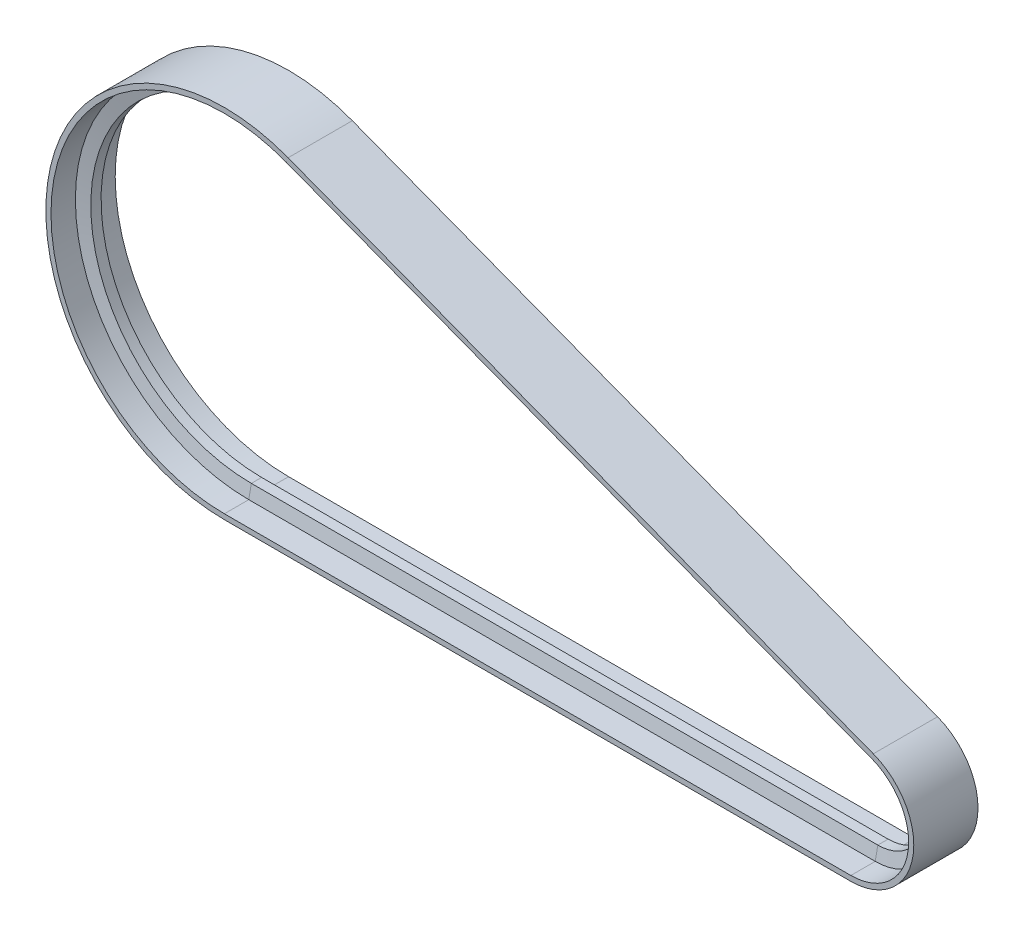
ISO-10303-21;
HEADER;
FILE_DESCRIPTION(('STEP AP214'),'2;1');
FILE_NAME('part.step','',(''),(''),'','','');
FILE_SCHEMA(('AUTOMOTIVE_DESIGN { 1 0 10303 214 1 1 1 1 }'));
ENDSEC;
DATA;
#1=APPLICATION_CONTEXT('core data for automotive mechanical design processes');
#2=APPLICATION_PROTOCOL_DEFINITION('international standard','automotive_design',2000,#1);
#3=PRODUCT_CONTEXT('',#1,'mechanical');
#4=PRODUCT('Part','Part','',(#3));
#5=PRODUCT_RELATED_PRODUCT_CATEGORY('part','',(#4));
#6=PRODUCT_DEFINITION_FORMATION('','',#4);
#7=PRODUCT_DEFINITION_CONTEXT('part definition',#1,'design');
#8=PRODUCT_DEFINITION('design','',#6,#7);
#9=PRODUCT_DEFINITION_SHAPE('','',#8);
#10=(LENGTH_UNIT() NAMED_UNIT(*) SI_UNIT(.MILLI.,.METRE.));
#11=(NAMED_UNIT(*) PLANE_ANGLE_UNIT() SI_UNIT($,.RADIAN.));
#12=(NAMED_UNIT(*) SI_UNIT($,.STERADIAN.) SOLID_ANGLE_UNIT());
#13=UNCERTAINTY_MEASURE_WITH_UNIT(LENGTH_MEASURE(1.E-05),#10,'distance_accuracy_value','');
#14=(GEOMETRIC_REPRESENTATION_CONTEXT(3) GLOBAL_UNCERTAINTY_ASSIGNED_CONTEXT((#13)) GLOBAL_UNIT_ASSIGNED_CONTEXT((#10,
#11,#12)) REPRESENTATION_CONTEXT('',''));
#15=CARTESIAN_POINT('',(0.,0.,0.));
#16=DIRECTION('',(0.,0.,1.));
#17=DIRECTION('',(1.,0.,0.));
#18=AXIS2_PLACEMENT_3D('',#15,#16,#17);
#19=CARTESIAN_POINT('',(24.0893315908228,63.0551671436004,12.5));
#20=DIRECTION('',(0.356878986530708,0.934150624349636,0.));
#21=DIRECTION('',(-0.934150624349636,0.356878986530709,0.));
#22=AXIS2_PLACEMENT_3D('',#19,#20,#21);
#23=PLANE('',#22);
#24=DIRECTION('',(0.934150624349636,-0.356878986530709,0.));
#25=VECTOR('',#24,1.);
#26=CARTESIAN_POINT('',(24.0893315908228,63.0551671436004,3.));
#27=LINE('',#26,#25);
#28=CARTESIAN_POINT('',(24.0893315908228,63.0551671436004,3.));
#29=VERTEX_POINT('',#28);
#30=CARTESIAN_POINT('',(251.912945947882,-23.9816109521333,3.));
#31=VERTEX_POINT('',#30);
#32=EDGE_CURVE('E558',#29,#31,#27,.T.);
#33=ORIENTED_EDGE('',*,*,#32,.T.);
#34=DIRECTION('',(0.,0.,-1.));
#35=VECTOR('',#34,1.);
#36=CARTESIAN_POINT('',(251.912945947882,-23.9816109521332,12.5));
#37=LINE('',#36,#35);
#38=CARTESIAN_POINT('',(251.912945947882,-23.9816109521332,12.5));
#39=VERTEX_POINT('',#38);
#40=EDGE_CURVE('E260',#39,#31,#37,.T.);
#41=ORIENTED_EDGE('',*,*,#40,.F.);
#42=DIRECTION('',(0.934150624349636,-0.356878986530709,0.));
#43=VECTOR('',#42,1.);
#44=CARTESIAN_POINT('',(24.0893315908228,63.0551671436004,12.5));
#45=LINE('',#44,#43);
#46=CARTESIAN_POINT('',(24.0893315908228,63.0551671436004,12.5));
#47=VERTEX_POINT('',#46);
#48=EDGE_CURVE('E224',#47,#39,#45,.T.);
#49=ORIENTED_EDGE('',*,*,#48,.F.);
#50=DIRECTION('',(0.,0.,-1.));
#51=VECTOR('',#50,1.);
#52=CARTESIAN_POINT('',(24.0893315908228,63.0551671436004,12.5));
#53=LINE('',#52,#51);
#54=EDGE_CURVE('E247',#47,#29,#53,.T.);
#55=ORIENTED_EDGE('',*,*,#54,.T.);
#56=EDGE_LOOP('',(#33,#41,#49,#55));
#57=FACE_BOUND('',#56,.T.);
#58=ADVANCED_FACE('F56',(#57),#23,.F.);
#59=DIRECTION('',(0.934150624349636,-0.356878986530709,0.));
#60=VECTOR('',#59,1.);
#61=CARTESIAN_POINT('',(24.0893315908228,63.0551671436004,-3.));
#62=LINE('',#61,#60);
#63=CARTESIAN_POINT('',(24.0893315908228,63.0551671436004,-3.));
#64=VERTEX_POINT('',#63);
#65=CARTESIAN_POINT('',(251.912945947882,-23.9816109521332,-3.));
#66=VERTEX_POINT('',#65);
#67=EDGE_CURVE('E556',#64,#66,#62,.T.);
#68=ORIENTED_EDGE('',*,*,#67,.F.);
#69=CARTESIAN_POINT('',(24.0893315908228,63.0551671436004,-12.5));
#70=VERTEX_POINT('',#69);
#71=EDGE_CURVE('E251',#64,#70,#53,.T.);
#72=ORIENTED_EDGE('',*,*,#71,.T.);
#73=DIRECTION('',(0.934150624349636,-0.356878986530709,0.));
#74=VECTOR('',#73,1.);
#75=CARTESIAN_POINT('',(24.0893315908228,63.0551671436004,-12.5));
#76=LINE('',#75,#74);
#77=CARTESIAN_POINT('',(251.912945947882,-23.9816109521332,-12.5));
#78=VERTEX_POINT('',#77);
#79=EDGE_CURVE('E236',#70,#78,#76,.T.);
#80=ORIENTED_EDGE('',*,*,#79,.T.);
#81=EDGE_CURVE('E235',#66,#78,#37,.T.);
#82=ORIENTED_EDGE('',*,*,#81,.F.);
#83=EDGE_LOOP('',(#68,#72,#80,#82));
#84=FACE_BOUND('',#83,.T.);
#85=ADVANCED_FACE('F317',(#84),#23,.F.);
#86=CARTESIAN_POINT('',(0.,0.,12.5));
#87=DIRECTION('',(0.,0.,-1.));
#88=DIRECTION('',(-1.,0.,0.));
#89=AXIS2_PLACEMENT_3D('',#86,#87,#88);
#90=CYLINDRICAL_SURFACE('',#89,67.5);
#91=DIRECTION('',(0.,0.,-1.));
#92=VECTOR('',#91,1.);
#93=CARTESIAN_POINT('',(0.,-67.5,12.5));
#94=LINE('',#93,#92);
#95=CARTESIAN_POINT('',(0.,-67.5,12.5));
#96=VERTEX_POINT('',#95);
#97=CARTESIAN_POINT('',(0.,-67.5,3.));
#98=VERTEX_POINT('',#97);
#99=EDGE_CURVE('E252',#96,#98,#94,.T.);
#100=ORIENTED_EDGE('',*,*,#99,.T.);
#101=CARTESIAN_POINT('',(0.,0.,3.));
#102=DIRECTION('',(0.,0.,-1.));
#103=DIRECTION('',(0.,-1.,0.));
#104=AXIS2_PLACEMENT_3D('',#101,#102,#103);
#105=CIRCLE('',#104,67.5);
#106=EDGE_CURVE('E555',#98,#29,#105,.T.);
#107=ORIENTED_EDGE('',*,*,#106,.T.);
#108=ORIENTED_EDGE('',*,*,#54,.F.);
#109=CARTESIAN_POINT('',(0.,0.,12.5));
#110=DIRECTION('',(0.,0.,1.));
#111=DIRECTION('',(1.,0.,0.));
#112=AXIS2_PLACEMENT_3D('',#109,#110,#111);
#113=CIRCLE('',#112,67.5);
#114=EDGE_CURVE('E233',#47,#96,#113,.T.);
#115=ORIENTED_EDGE('',*,*,#114,.T.);
#116=EDGE_LOOP('',(#100,#107,#108,#115));
#117=FACE_BOUND('',#116,.T.);
#118=ADVANCED_FACE('F322',(#117),#90,.F.);
#119=ORIENTED_EDGE('',*,*,#71,.F.);
#120=CARTESIAN_POINT('',(0.,0.,-3.));
#121=DIRECTION('',(0.,0.,-1.));
#122=DIRECTION('',(0.,-1.,0.));
#123=AXIS2_PLACEMENT_3D('',#120,#121,#122);
#124=CIRCLE('',#123,67.5);
#125=CARTESIAN_POINT('',(0.,-67.5,-3.));
#126=VERTEX_POINT('',#125);
#127=EDGE_CURVE('E217',#126,#64,#124,.T.);
#128=ORIENTED_EDGE('',*,*,#127,.F.);
#129=CARTESIAN_POINT('',(0.,-67.5,-12.5));
#130=VERTEX_POINT('',#129);
#131=EDGE_CURVE('E255',#126,#130,#94,.T.);
#132=ORIENTED_EDGE('',*,*,#131,.T.);
#133=CARTESIAN_POINT('',(0.,0.,-12.5));
#134=DIRECTION('',(0.,0.,1.));
#135=DIRECTION('',(1.,0.,0.));
#136=AXIS2_PLACEMENT_3D('',#133,#134,#135);
#137=CIRCLE('',#136,67.5);
#138=EDGE_CURVE('E228',#70,#130,#137,.T.);
#139=ORIENTED_EDGE('',*,*,#138,.F.);
#140=EDGE_LOOP('',(#119,#128,#132,#139));
#141=FACE_BOUND('',#140,.T.);
#142=ADVANCED_FACE('F335',(#141),#90,.F.);
#143=CARTESIAN_POINT('',(0.,-67.5,12.5));
#144=DIRECTION('',(0.,1.,0.));
#145=DIRECTION('',(0.,0.,1.));
#146=AXIS2_PLACEMENT_3D('',#143,#144,#145);
#147=PLANE('',#146);
#148=DIRECTION('',(0.,0.,-1.));
#149=VECTOR('',#148,1.);
#150=CARTESIAN_POINT('',(243.883168750941,-67.5,12.5));
#151=LINE('',#150,#149);
#152=CARTESIAN_POINT('',(243.883168750941,-67.5,12.5));
#153=VERTEX_POINT('',#152);
#154=CARTESIAN_POINT('',(243.883168750941,-67.5,3.));
#155=VERTEX_POINT('',#154);
#156=EDGE_CURVE('E256',#153,#155,#151,.T.);
#157=ORIENTED_EDGE('',*,*,#156,.T.);
#158=DIRECTION('',(-1.,0.,0.));
#159=VECTOR('',#158,1.);
#160=CARTESIAN_POINT('',(243.883168750941,-67.5,3.));
#161=LINE('',#160,#159);
#162=EDGE_CURVE('E81',#155,#98,#161,.T.);
#163=ORIENTED_EDGE('',*,*,#162,.T.);
#164=ORIENTED_EDGE('',*,*,#99,.F.);
#165=DIRECTION('',(1.,0.,0.));
#166=VECTOR('',#165,1.);
#167=CARTESIAN_POINT('',(0.,-67.5,12.5));
#168=LINE('',#167,#166);
#169=EDGE_CURVE('E230',#96,#153,#168,.T.);
#170=ORIENTED_EDGE('',*,*,#169,.T.);
#171=EDGE_LOOP('',(#157,#163,#164,#170));
#172=FACE_BOUND('',#171,.T.);
#173=ADVANCED_FACE('F332',(#172),#147,.T.);
#174=ORIENTED_EDGE('',*,*,#131,.F.);
#175=DIRECTION('',(-1.,0.,0.));
#176=VECTOR('',#175,1.);
#177=CARTESIAN_POINT('',(243.883168750941,-67.5,-3.));
#178=LINE('',#177,#176);
#179=CARTESIAN_POINT('',(243.883168750941,-67.5,-3.));
#180=VERTEX_POINT('',#179);
#181=EDGE_CURVE('E208',#180,#126,#178,.T.);
#182=ORIENTED_EDGE('',*,*,#181,.F.);
#183=CARTESIAN_POINT('',(243.883168750941,-67.5,-12.5));
#184=VERTEX_POINT('',#183);
#185=EDGE_CURVE('E259',#180,#184,#151,.T.);
#186=ORIENTED_EDGE('',*,*,#185,.T.);
#187=DIRECTION('',(1.,0.,0.));
#188=VECTOR('',#187,1.);
#189=CARTESIAN_POINT('',(0.,-67.5,-12.5));
#190=LINE('',#189,#188);
#191=EDGE_CURVE('E242',#130,#184,#190,.T.);
#192=ORIENTED_EDGE('',*,*,#191,.F.);
#193=EDGE_LOOP('',(#174,#182,#186,#192));
#194=FACE_BOUND('',#193,.T.);
#195=ADVANCED_FACE('F330',(#194),#147,.T.);
#196=CARTESIAN_POINT('',(243.883168750941,-45.,12.5));
#197=DIRECTION('',(0.,0.,-1.));
#198=DIRECTION('',(-1.,0.,0.));
#199=AXIS2_PLACEMENT_3D('',#196,#197,#198);
#200=CYLINDRICAL_SURFACE('',#199,22.5);
#201=ORIENTED_EDGE('',*,*,#40,.T.);
#202=CARTESIAN_POINT('',(243.883168750941,-45.,3.));
#203=DIRECTION('',(0.,0.,-1.));
#204=DIRECTION('',(0.356878986530709,0.934150624349636,0.));
#205=AXIS2_PLACEMENT_3D('',#202,#203,#204);
#206=CIRCLE('',#205,22.5);
#207=EDGE_CURVE('E552',#31,#155,#206,.T.);
#208=ORIENTED_EDGE('',*,*,#207,.T.);
#209=ORIENTED_EDGE('',*,*,#156,.F.);
#210=CARTESIAN_POINT('',(243.883168750941,-45.,12.5));
#211=DIRECTION('',(0.,0.,1.));
#212=DIRECTION('',(1.,0.,0.));
#213=AXIS2_PLACEMENT_3D('',#210,#211,#212);
#214=CIRCLE('',#213,22.5);
#215=EDGE_CURVE('E227',#153,#39,#214,.T.);
#216=ORIENTED_EDGE('',*,*,#215,.T.);
#217=EDGE_LOOP('',(#201,#208,#209,#216));
#218=FACE_BOUND('',#217,.T.);
#219=ADVANCED_FACE('F326',(#218),#200,.F.);
#220=ORIENTED_EDGE('',*,*,#185,.F.);
#221=CARTESIAN_POINT('',(243.883168750941,-45.,-3.));
#222=DIRECTION('',(0.,0.,-1.));
#223=DIRECTION('',(0.356878986530709,0.934150624349636,0.));
#224=AXIS2_PLACEMENT_3D('',#221,#222,#223);
#225=CIRCLE('',#224,22.5);
#226=EDGE_CURVE('E223',#66,#180,#225,.T.);
#227=ORIENTED_EDGE('',*,*,#226,.F.);
#228=ORIENTED_EDGE('',*,*,#81,.T.);
#229=CARTESIAN_POINT('',(243.883168750941,-45.,-12.5));
#230=DIRECTION('',(0.,0.,1.));
#231=DIRECTION('',(1.,0.,0.));
#232=AXIS2_PLACEMENT_3D('',#229,#230,#231);
#233=CIRCLE('',#232,22.5);
#234=EDGE_CURVE('E239',#184,#78,#233,.T.);
#235=ORIENTED_EDGE('',*,*,#234,.F.);
#236=EDGE_LOOP('',(#220,#227,#228,#235));
#237=FACE_BOUND('',#236,.T.);
#238=ADVANCED_FACE('F329',(#237),#200,.F.);
#239=CARTESIAN_POINT('',(24.8030895638842,64.9234683922997,12.5));
#240=DIRECTION('',(0.356878986530708,0.934150624349636,0.));
#241=DIRECTION('',(-0.934150624349636,0.356878986530709,0.));
#242=AXIS2_PLACEMENT_3D('',#239,#240,#241);
#243=PLANE('',#242);
#244=DIRECTION('',(0.934150624349636,-0.356878986530709,0.));
#245=VECTOR('',#244,1.);
#246=CARTESIAN_POINT('',(24.8030895638842,64.9234683922997,-12.5));
#247=LINE('',#246,#245);
#248=CARTESIAN_POINT('',(24.8030895638842,64.9234683922997,-12.5));
#249=VERTEX_POINT('',#248);
#250=CARTESIAN_POINT('',(252.626703920943,-22.113309703434,-12.5));
#251=VERTEX_POINT('',#250);
#252=EDGE_CURVE('E250',#249,#251,#247,.T.);
#253=ORIENTED_EDGE('',*,*,#252,.F.);
#254=DIRECTION('',(0.,0.,-1.));
#255=VECTOR('',#254,1.);
#256=CARTESIAN_POINT('',(24.8030895638842,64.9234683922997,12.5));
#257=LINE('',#256,#255);
#258=CARTESIAN_POINT('',(24.8030895638842,64.9234683922997,12.5));
#259=VERTEX_POINT('',#258);
#260=EDGE_CURVE('E12',#259,#249,#257,.T.);
#261=ORIENTED_EDGE('',*,*,#260,.F.);
#262=DIRECTION('',(0.934150624349636,-0.356878986530709,0.));
#263=VECTOR('',#262,1.);
#264=CARTESIAN_POINT('',(24.8030895638842,64.9234683922997,12.5));
#265=LINE('',#264,#263);
#266=CARTESIAN_POINT('',(252.626703920943,-22.113309703434,12.5));
#267=VERTEX_POINT('',#266);
#268=EDGE_CURVE('E263',#259,#267,#265,.T.);
#269=ORIENTED_EDGE('',*,*,#268,.T.);
#270=DIRECTION('',(0.,0.,-1.));
#271=VECTOR('',#270,1.);
#272=CARTESIAN_POINT('',(252.626703920943,-22.113309703434,12.5));
#273=LINE('',#272,#271);
#274=EDGE_CURVE('E60',#267,#251,#273,.T.);
#275=ORIENTED_EDGE('',*,*,#274,.T.);
#276=EDGE_LOOP('',(#253,#261,#269,#275));
#277=FACE_BOUND('',#276,.T.);
#278=ADVANCED_FACE('F58',(#277),#243,.T.);
#279=CARTESIAN_POINT('',(0.,0.,12.5));
#280=DIRECTION('',(0.,0.,-1.));
#281=DIRECTION('',(-1.,0.,0.));
#282=AXIS2_PLACEMENT_3D('',#279,#280,#281);
#283=CYLINDRICAL_SURFACE('',#282,69.5);
#284=CARTESIAN_POINT('',(0.,0.,-12.5));
#285=DIRECTION('',(0.,0.,1.));
#286=DIRECTION('',(1.,0.,0.));
#287=AXIS2_PLACEMENT_3D('',#284,#285,#286);
#288=CIRCLE('',#287,69.5);
#289=CARTESIAN_POINT('',(0.,-69.5,-12.5));
#290=VERTEX_POINT('',#289);
#291=EDGE_CURVE('E267',#249,#290,#288,.T.);
#292=ORIENTED_EDGE('',*,*,#291,.T.);
#293=DIRECTION('',(0.,0.,-1.));
#294=VECTOR('',#293,1.);
#295=CARTESIAN_POINT('',(0.,-69.5,12.5));
#296=LINE('',#295,#294);
#297=CARTESIAN_POINT('',(0.,-69.5,12.5));
#298=VERTEX_POINT('',#297);
#299=EDGE_CURVE('E65',#298,#290,#296,.T.);
#300=ORIENTED_EDGE('',*,*,#299,.F.);
#301=CARTESIAN_POINT('',(0.,0.,12.5));
#302=DIRECTION('',(0.,0.,1.));
#303=DIRECTION('',(1.,0.,0.));
#304=AXIS2_PLACEMENT_3D('',#301,#302,#303);
#305=CIRCLE('',#304,69.5);
#306=EDGE_CURVE('E271',#259,#298,#305,.T.);
#307=ORIENTED_EDGE('',*,*,#306,.F.);
#308=ORIENTED_EDGE('',*,*,#260,.T.);
#309=EDGE_LOOP('',(#292,#300,#307,#308));
#310=FACE_BOUND('',#309,.T.);
#311=ADVANCED_FACE('F299',(#310),#283,.T.);
#312=CARTESIAN_POINT('',(0.,-69.5,12.5));
#313=DIRECTION('',(0.,1.,0.));
#314=DIRECTION('',(0.,0.,1.));
#315=AXIS2_PLACEMENT_3D('',#312,#313,#314);
#316=PLANE('',#315);
#317=DIRECTION('',(1.,0.,0.));
#318=VECTOR('',#317,1.);
#319=CARTESIAN_POINT('',(0.,-69.5,-12.5));
#320=LINE('',#319,#318);
#321=CARTESIAN_POINT('',(243.883168750941,-69.5,-12.5));
#322=VERTEX_POINT('',#321);
#323=EDGE_CURVE('E278',#290,#322,#320,.T.);
#324=ORIENTED_EDGE('',*,*,#323,.T.);
#325=DIRECTION('',(0.,0.,-1.));
#326=VECTOR('',#325,1.);
#327=CARTESIAN_POINT('',(243.883168750941,-69.5,12.5));
#328=LINE('',#327,#326);
#329=CARTESIAN_POINT('',(243.883168750941,-69.5,12.5));
#330=VERTEX_POINT('',#329);
#331=EDGE_CURVE('E282',#330,#322,#328,.T.);
#332=ORIENTED_EDGE('',*,*,#331,.F.);
#333=DIRECTION('',(1.,0.,0.));
#334=VECTOR('',#333,1.);
#335=CARTESIAN_POINT('',(0.,-69.5,12.5));
#336=LINE('',#335,#334);
#337=EDGE_CURVE('E269',#298,#330,#336,.T.);
#338=ORIENTED_EDGE('',*,*,#337,.F.);
#339=ORIENTED_EDGE('',*,*,#299,.T.);
#340=EDGE_LOOP('',(#324,#332,#338,#339));
#341=FACE_BOUND('',#340,.T.);
#342=ADVANCED_FACE('F303',(#341),#316,.F.);
#343=CARTESIAN_POINT('',(243.883168750941,-45.,12.5));
#344=DIRECTION('',(0.,0.,-1.));
#345=DIRECTION('',(-1.,0.,0.));
#346=AXIS2_PLACEMENT_3D('',#343,#344,#345);
#347=CYLINDRICAL_SURFACE('',#346,24.5);
#348=CARTESIAN_POINT('',(243.883168750941,-45.,-12.5));
#349=DIRECTION('',(0.,0.,1.));
#350=DIRECTION('',(1.,0.,0.));
#351=AXIS2_PLACEMENT_3D('',#348,#349,#350);
#352=CIRCLE('',#351,24.5);
#353=EDGE_CURVE('E275',#322,#251,#352,.T.);
#354=ORIENTED_EDGE('',*,*,#353,.T.);
#355=ORIENTED_EDGE('',*,*,#274,.F.);
#356=CARTESIAN_POINT('',(243.883168750941,-45.,12.5));
#357=DIRECTION('',(0.,0.,1.));
#358=DIRECTION('',(1.,0.,0.));
#359=AXIS2_PLACEMENT_3D('',#356,#357,#358);
#360=CIRCLE('',#359,24.5);
#361=EDGE_CURVE('E266',#330,#267,#360,.T.);
#362=ORIENTED_EDGE('',*,*,#361,.F.);
#363=ORIENTED_EDGE('',*,*,#331,.T.);
#364=EDGE_LOOP('',(#354,#355,#362,#363));
#365=FACE_BOUND('',#364,.T.);
#366=ADVANCED_FACE('F292',(#365),#347,.T.);
#367=CARTESIAN_POINT('',(243.883168750941,-45.,12.5));
#368=DIRECTION('',(0.,0.,1.));
#369=DIRECTION('',(1.,0.,0.));
#370=AXIS2_PLACEMENT_3D('',#367,#368,#369);
#371=PLANE('',#370);
#372=ORIENTED_EDGE('',*,*,#48,.T.);
#373=ORIENTED_EDGE('',*,*,#215,.F.);
#374=ORIENTED_EDGE('',*,*,#169,.F.);
#375=ORIENTED_EDGE('',*,*,#114,.F.);
#376=EDGE_LOOP('',(#372,#373,#374,#375));
#377=FACE_BOUND('',#376,.T.);
#378=ORIENTED_EDGE('',*,*,#268,.F.);
#379=ORIENTED_EDGE('',*,*,#306,.T.);
#380=ORIENTED_EDGE('',*,*,#337,.T.);
#381=ORIENTED_EDGE('',*,*,#361,.T.);
#382=EDGE_LOOP('',(#378,#379,#380,#381));
#383=FACE_BOUND('',#382,.T.);
#384=ADVANCED_FACE('F305',(#377,#383),#371,.T.);
#385=CARTESIAN_POINT('',(243.883168750941,-45.,-12.5));
#386=DIRECTION('',(0.,0.,1.));
#387=DIRECTION('',(1.,0.,0.));
#388=AXIS2_PLACEMENT_3D('',#385,#386,#387);
#389=PLANE('',#388);
#390=ORIENTED_EDGE('',*,*,#234,.T.);
#391=ORIENTED_EDGE('',*,*,#79,.F.);
#392=ORIENTED_EDGE('',*,*,#138,.T.);
#393=ORIENTED_EDGE('',*,*,#191,.T.);
#394=EDGE_LOOP('',(#390,#391,#392,#393));
#395=FACE_BOUND('',#394,.T.);
#396=ORIENTED_EDGE('',*,*,#252,.T.);
#397=ORIENTED_EDGE('',*,*,#353,.F.);
#398=ORIENTED_EDGE('',*,*,#323,.F.);
#399=ORIENTED_EDGE('',*,*,#291,.F.);
#400=EDGE_LOOP('',(#396,#397,#398,#399));
#401=FACE_BOUND('',#400,.T.);
#402=ADVANCED_FACE('F296',(#395,#401),#389,.F.);
#403=CARTESIAN_POINT('',(243.883168750941,-62.5,2.));
#404=DIRECTION('',(0.,-1.,0.));
#405=DIRECTION('',(0.,0.,-1.));
#406=AXIS2_PLACEMENT_3D('',#403,#404,#405);
#407=PLANE('',#406);
#408=DIRECTION('',(0.,0.,1.));
#409=VECTOR('',#408,1.);
#410=CARTESIAN_POINT('',(243.883168750941,-62.5,2.));
#411=LINE('',#410,#409);
#412=CARTESIAN_POINT('',(243.883168750941,-62.5,-2.));
#413=VERTEX_POINT('',#412);
#414=CARTESIAN_POINT('',(243.883168750941,-62.5,2.));
#415=VERTEX_POINT('',#414);
#416=EDGE_CURVE('E199',#413,#415,#411,.T.);
#417=ORIENTED_EDGE('',*,*,#416,.F.);
#418=DIRECTION('',(-1.,0.,0.));
#419=VECTOR('',#418,1.);
#420=CARTESIAN_POINT('',(243.883168750941,-62.5,-2.));
#421=LINE('',#420,#419);
#422=CARTESIAN_POINT('',(0.,-62.5,-2.));
#423=VERTEX_POINT('',#422);
#424=EDGE_CURVE('E197',#413,#423,#421,.T.);
#425=ORIENTED_EDGE('',*,*,#424,.T.);
#426=DIRECTION('',(0.,0.,1.));
#427=VECTOR('',#426,1.);
#428=CARTESIAN_POINT('',(0.,-62.5,2.));
#429=LINE('',#428,#427);
#430=CARTESIAN_POINT('',(0.,-62.5,2.));
#431=VERTEX_POINT('',#430);
#432=EDGE_CURVE('E172',#423,#431,#429,.T.);
#433=ORIENTED_EDGE('',*,*,#432,.T.);
#434=DIRECTION('',(-1.,0.,0.));
#435=VECTOR('',#434,1.);
#436=CARTESIAN_POINT('',(243.883168750941,-62.5,2.));
#437=LINE('',#436,#435);
#438=EDGE_CURVE('E203',#415,#431,#437,.T.);
#439=ORIENTED_EDGE('',*,*,#438,.F.);
#440=EDGE_LOOP('',(#417,#425,#433,#439));
#441=FACE_BOUND('',#440,.T.);
#442=ADVANCED_FACE('F198',(#441),#407,.F.);
#443=CARTESIAN_POINT('',(0.,0.,0.));
#444=DIRECTION('',(0.,0.,-1.));
#445=DIRECTION('',(-1.,0.,0.));
#446=AXIS2_PLACEMENT_3D('',#443,#444,#445);
#447=CYLINDRICAL_SURFACE('',#446,62.5);
#448=CARTESIAN_POINT('',(0.,0.,2.));
#449=DIRECTION('',(0.,0.,-1.));
#450=DIRECTION('',(0.,-1.,0.));
#451=AXIS2_PLACEMENT_3D('',#448,#449,#450);
#452=CIRCLE('',#451,62.5);
#453=CARTESIAN_POINT('',(22.3049366581693,58.3844140218523,2.));
#454=VERTEX_POINT('',#453);
#455=EDGE_CURVE('E178',#431,#454,#452,.T.);
#456=ORIENTED_EDGE('',*,*,#455,.F.);
#457=ORIENTED_EDGE('',*,*,#432,.F.);
#458=CARTESIAN_POINT('',(0.,0.,-2.));
#459=DIRECTION('',(0.,0.,-1.));
#460=DIRECTION('',(0.,-1.,0.));
#461=AXIS2_PLACEMENT_3D('',#458,#459,#460);
#462=CIRCLE('',#461,62.5);
#463=CARTESIAN_POINT('',(22.3049366581693,58.3844140218523,-2.));
#464=VERTEX_POINT('',#463);
#465=EDGE_CURVE('E176',#423,#464,#462,.T.);
#466=ORIENTED_EDGE('',*,*,#465,.T.);
#467=DIRECTION('',(0.,0.,1.));
#468=VECTOR('',#467,1.);
#469=CARTESIAN_POINT('',(22.3049366581693,58.3844140218522,2.));
#470=LINE('',#469,#468);
#471=EDGE_CURVE('E194',#464,#454,#470,.T.);
#472=ORIENTED_EDGE('',*,*,#471,.T.);
#473=EDGE_LOOP('',(#456,#457,#466,#472));
#474=FACE_BOUND('',#473,.T.);
#475=ADVANCED_FACE('F174',(#474),#447,.F.);
#476=CARTESIAN_POINT('',(0.,0.,2.));
#477=DIRECTION('',(0.,0.,1.));
#478=DIRECTION('',(1.,0.,0.));
#479=AXIS2_PLACEMENT_3D('',#476,#477,#478);
#480=CONICAL_SURFACE('',#479,62.5,1.37340076694502);
#481=ORIENTED_EDGE('',*,*,#106,.F.);
#482=DIRECTION('',(0.,-0.98058067569092,0.196116135138184));
#483=VECTOR('',#482,1.);
#484=CARTESIAN_POINT('',(0.,-67.5,3.));
#485=LINE('',#484,#483);
#486=EDGE_CURVE('E183',#431,#98,#485,.T.);
#487=ORIENTED_EDGE('',*,*,#486,.F.);
#488=ORIENTED_EDGE('',*,*,#455,.T.);
#489=DIRECTION('',(0.349948637752173,0.916010050421861,0.196116135138184));
#490=VECTOR('',#489,1.);
#491=CARTESIAN_POINT('',(24.0893315908228,63.0551671436004,3.));
#492=LINE('',#491,#490);
#493=EDGE_CURVE('E571',#454,#29,#492,.T.);
#494=ORIENTED_EDGE('',*,*,#493,.T.);
#495=EDGE_LOOP('',(#481,#487,#488,#494));
#496=FACE_BOUND('',#495,.T.);
#497=ADVANCED_FACE('F356',(#496),#480,.F.);
#498=CARTESIAN_POINT('',(0.,0.,-3.));
#499=DIRECTION('',(0.,0.,-1.));
#500=DIRECTION('',(-1.,0.,0.));
#501=AXIS2_PLACEMENT_3D('',#498,#499,#500);
#502=CONICAL_SURFACE('',#501,67.5,1.37340076694502);
#503=DIRECTION('',(-0.349948637752173,-0.916010050421861,0.196116135138184));
#504=VECTOR('',#503,1.);
#505=CARTESIAN_POINT('',(22.3049366581693,58.3844140218522,-2.));
#506=LINE('',#505,#504);
#507=EDGE_CURVE('E192',#64,#464,#506,.T.);
#508=ORIENTED_EDGE('',*,*,#507,.T.);
#509=ORIENTED_EDGE('',*,*,#465,.F.);
#510=DIRECTION('',(0.,0.98058067569092,0.196116135138184));
#511=VECTOR('',#510,1.);
#512=CARTESIAN_POINT('',(0.,-62.5,-2.));
#513=LINE('',#512,#511);
#514=EDGE_CURVE('E189',#126,#423,#513,.T.);
#515=ORIENTED_EDGE('',*,*,#514,.F.);
#516=ORIENTED_EDGE('',*,*,#127,.T.);
#517=EDGE_LOOP('',(#508,#509,#515,#516));
#518=FACE_BOUND('',#517,.T.);
#519=ADVANCED_FACE('F187',(#518),#502,.F.);
#520=CARTESIAN_POINT('',(22.3049366581693,58.3844140218522,2.));
#521=DIRECTION('',(0.356878986530709,0.934150624349636,0.));
#522=DIRECTION('',(-0.934150624349636,0.356878986530709,0.));
#523=AXIS2_PLACEMENT_3D('',#520,#521,#522);
#524=PLANE('',#523);
#525=DIRECTION('',(0.934150624349636,-0.356878986530709,0.));
#526=VECTOR('',#525,1.);
#527=CARTESIAN_POINT('',(22.3049366581693,58.3844140218522,2.));
#528=LINE('',#527,#526);
#529=CARTESIAN_POINT('',(250.128551015229,-28.6523640738815,2.));
#530=VERTEX_POINT('',#529);
#531=EDGE_CURVE('E567',#454,#530,#528,.T.);
#532=ORIENTED_EDGE('',*,*,#531,.F.);
#533=ORIENTED_EDGE('',*,*,#471,.F.);
#534=DIRECTION('',(0.934150624349636,-0.356878986530709,0.));
#535=VECTOR('',#534,1.);
#536=CARTESIAN_POINT('',(22.3049366581693,58.3844140218522,-2.));
#537=LINE('',#536,#535);
#538=CARTESIAN_POINT('',(250.128551015229,-28.6523640738815,-2.));
#539=VERTEX_POINT('',#538);
#540=EDGE_CURVE('E216',#464,#539,#537,.T.);
#541=ORIENTED_EDGE('',*,*,#540,.T.);
#542=DIRECTION('',(0.,0.,1.));
#543=VECTOR('',#542,1.);
#544=CARTESIAN_POINT('',(250.128551015229,-28.6523640738814,2.));
#545=LINE('',#544,#543);
#546=EDGE_CURVE('E557',#539,#530,#545,.T.);
#547=ORIENTED_EDGE('',*,*,#546,.T.);
#548=EDGE_LOOP('',(#532,#533,#541,#547));
#549=FACE_BOUND('',#548,.T.);
#550=ADVANCED_FACE('F355',(#549),#524,.F.);
#551=CARTESIAN_POINT('',(24.0893315908228,63.0551671436004,3.));
#552=DIRECTION('',(0.0699897275504345,0.183202010084372,-0.98058067569092));
#553=DIRECTION('',(0.,0.982991253187067,0.183652378578986));
#554=AXIS2_PLACEMENT_3D('',#551,#552,#553);
#555=PLANE('',#554);
#556=ORIENTED_EDGE('',*,*,#32,.F.);
#557=ORIENTED_EDGE('',*,*,#493,.F.);
#558=ORIENTED_EDGE('',*,*,#531,.T.);
#559=DIRECTION('',(0.349948637752173,0.916010050421861,0.196116135138184));
#560=VECTOR('',#559,1.);
#561=CARTESIAN_POINT('',(251.912945947882,-23.9816109521332,3.));
#562=LINE('',#561,#560);
#563=EDGE_CURVE('E220',#530,#31,#562,.T.);
#564=ORIENTED_EDGE('',*,*,#563,.T.);
#565=EDGE_LOOP('',(#556,#557,#558,#564));
#566=FACE_BOUND('',#565,.T.);
#567=ADVANCED_FACE('F351',(#566),#555,.F.);
#568=CARTESIAN_POINT('',(22.3049366581693,58.3844140218522,-2.));
#569=DIRECTION('',(0.0699897275504346,0.183202010084372,0.98058067569092));
#570=DIRECTION('',(0.,-0.982991253187067,0.183652378578986));
#571=AXIS2_PLACEMENT_3D('',#568,#569,#570);
#572=PLANE('',#571);
#573=DIRECTION('',(-0.349948637752173,-0.916010050421861,0.196116135138184));
#574=VECTOR('',#573,1.);
#575=CARTESIAN_POINT('',(250.128551015229,-28.6523640738814,-2.));
#576=LINE('',#575,#574);
#577=EDGE_CURVE('E73',#66,#539,#576,.T.);
#578=ORIENTED_EDGE('',*,*,#577,.T.);
#579=ORIENTED_EDGE('',*,*,#540,.F.);
#580=ORIENTED_EDGE('',*,*,#507,.F.);
#581=ORIENTED_EDGE('',*,*,#67,.T.);
#582=EDGE_LOOP('',(#578,#579,#580,#581));
#583=FACE_BOUND('',#582,.T.);
#584=ADVANCED_FACE('F347',(#583),#572,.F.);
#585=CARTESIAN_POINT('',(243.883168750941,-45.,0.));
#586=DIRECTION('',(0.,0.,-1.));
#587=DIRECTION('',(-1.,0.,0.));
#588=AXIS2_PLACEMENT_3D('',#585,#586,#587);
#589=CYLINDRICAL_SURFACE('',#588,17.5);
#590=CARTESIAN_POINT('',(243.883168750941,-45.,2.));
#591=DIRECTION('',(0.,0.,-1.));
#592=DIRECTION('',(0.35687898653071,0.934150624349635,0.));
#593=AXIS2_PLACEMENT_3D('',#590,#591,#592);
#594=CIRCLE('',#593,17.5);
#595=EDGE_CURVE('E562',#530,#415,#594,.T.);
#596=ORIENTED_EDGE('',*,*,#595,.F.);
#597=ORIENTED_EDGE('',*,*,#546,.F.);
#598=CARTESIAN_POINT('',(243.883168750941,-45.,-2.));
#599=DIRECTION('',(0.,0.,-1.));
#600=DIRECTION('',(0.35687898653071,0.934150624349635,0.));
#601=AXIS2_PLACEMENT_3D('',#598,#599,#600);
#602=CIRCLE('',#601,17.5);
#603=EDGE_CURVE('E219',#539,#413,#602,.T.);
#604=ORIENTED_EDGE('',*,*,#603,.T.);
#605=ORIENTED_EDGE('',*,*,#416,.T.);
#606=EDGE_LOOP('',(#596,#597,#604,#605));
#607=FACE_BOUND('',#606,.T.);
#608=ADVANCED_FACE('F350',(#607),#589,.F.);
#609=CARTESIAN_POINT('',(243.883168750941,-45.,2.));
#610=DIRECTION('',(0.,0.,1.));
#611=DIRECTION('',(1.,0.,0.));
#612=AXIS2_PLACEMENT_3D('',#609,#610,#611);
#613=CONICAL_SURFACE('',#612,17.5,1.37340076694502);
#614=ORIENTED_EDGE('',*,*,#207,.F.);
#615=ORIENTED_EDGE('',*,*,#563,.F.);
#616=ORIENTED_EDGE('',*,*,#595,.T.);
#617=DIRECTION('',(0.,-0.98058067569092,0.196116135138184));
#618=VECTOR('',#617,1.);
#619=CARTESIAN_POINT('',(243.883168750941,-67.5,3.));
#620=LINE('',#619,#618);
#621=EDGE_CURVE('E560',#415,#155,#620,.T.);
#622=ORIENTED_EDGE('',*,*,#621,.T.);
#623=EDGE_LOOP('',(#614,#615,#616,#622));
#624=FACE_BOUND('',#623,.T.);
#625=ADVANCED_FACE('F346',(#624),#613,.F.);
#626=CARTESIAN_POINT('',(243.883168750941,-45.,-3.));
#627=DIRECTION('',(0.,0.,-1.));
#628=DIRECTION('',(-1.,0.,0.));
#629=AXIS2_PLACEMENT_3D('',#626,#627,#628);
#630=CONICAL_SURFACE('',#629,22.5,1.37340076694502);
#631=DIRECTION('',(0.,0.98058067569092,0.196116135138184));
#632=VECTOR('',#631,1.);
#633=CARTESIAN_POINT('',(243.883168750941,-62.5,-2.));
#634=LINE('',#633,#632);
#635=EDGE_CURVE('E204',#180,#413,#634,.T.);
#636=ORIENTED_EDGE('',*,*,#635,.T.);
#637=ORIENTED_EDGE('',*,*,#603,.F.);
#638=ORIENTED_EDGE('',*,*,#577,.F.);
#639=ORIENTED_EDGE('',*,*,#226,.T.);
#640=EDGE_LOOP('',(#636,#637,#638,#639));
#641=FACE_BOUND('',#640,.T.);
#642=ADVANCED_FACE('F343',(#641),#630,.F.);
#643=CARTESIAN_POINT('',(243.883168750941,-67.5,3.));
#644=DIRECTION('',(0.,-0.196116135138184,-0.98058067569092));
#645=DIRECTION('',(0.,0.98058067569092,-0.196116135138184));
#646=AXIS2_PLACEMENT_3D('',#643,#644,#645);
#647=PLANE('',#646);
#648=ORIENTED_EDGE('',*,*,#438,.T.);
#649=ORIENTED_EDGE('',*,*,#486,.T.);
#650=ORIENTED_EDGE('',*,*,#162,.F.);
#651=ORIENTED_EDGE('',*,*,#621,.F.);
#652=EDGE_LOOP('',(#648,#649,#650,#651));
#653=FACE_BOUND('',#652,.T.);
#654=ADVANCED_FACE('F342',(#653),#647,.F.);
#655=CARTESIAN_POINT('',(243.883168750941,-62.5,-2.));
#656=DIRECTION('',(0.,-0.196116135138184,0.98058067569092));
#657=DIRECTION('',(0.,-0.98058067569092,-0.196116135138184));
#658=AXIS2_PLACEMENT_3D('',#655,#656,#657);
#659=PLANE('',#658);
#660=ORIENTED_EDGE('',*,*,#181,.T.);
#661=ORIENTED_EDGE('',*,*,#514,.T.);
#662=ORIENTED_EDGE('',*,*,#424,.F.);
#663=ORIENTED_EDGE('',*,*,#635,.F.);
#664=EDGE_LOOP('',(#660,#661,#662,#663));
#665=FACE_BOUND('',#664,.T.);
#666=ADVANCED_FACE('F206',(#665),#659,.F.);
#667=CLOSED_SHELL('',(#58,#85,#118,#142,#173,#195,#219,#238,#278,#311,#342,#366,#384,#402,#442,
#475,#497,#519,#550,#567,#584,#608,#625,#642,#654,#666));
#668=MANIFOLD_SOLID_BREP('B2',#667);
#669=ADVANCED_BREP_SHAPE_REPRESENTATION('',(#18,#668),#14);
#670=SHAPE_DEFINITION_REPRESENTATION(#9,#669);
ENDSEC;
END-ISO-10303-21;
